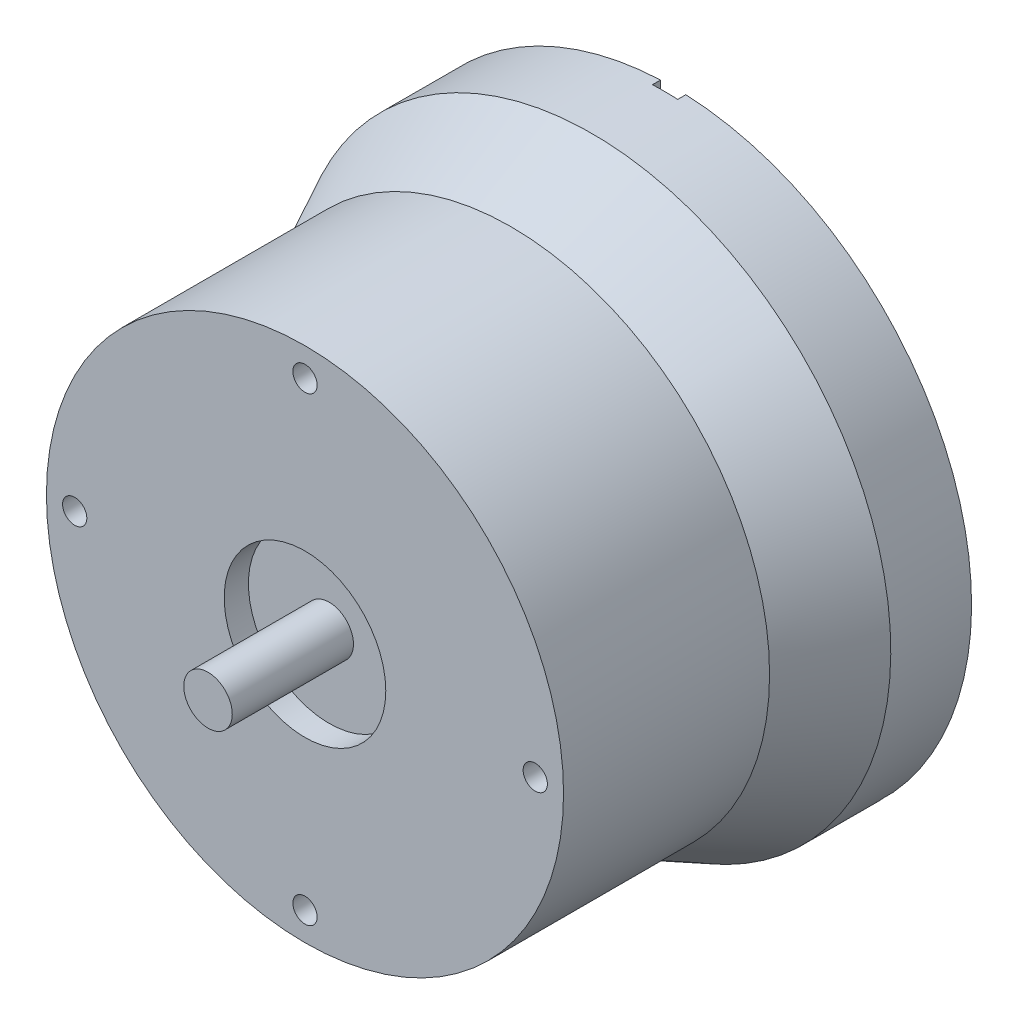
ISO-10303-21;
HEADER;
FILE_DESCRIPTION(('STEP AP214'),'2;1');
FILE_NAME('part.step','',(''),(''),'','','');
FILE_SCHEMA(('AUTOMOTIVE_DESIGN { 1 0 10303 214 1 1 1 1 }'));
ENDSEC;
DATA;
#1=APPLICATION_CONTEXT('core data for automotive mechanical design processes');
#2=APPLICATION_PROTOCOL_DEFINITION('international standard','automotive_design',2000,#1);
#3=PRODUCT_CONTEXT('',#1,'mechanical');
#4=PRODUCT('Part','Part','',(#3));
#5=PRODUCT_RELATED_PRODUCT_CATEGORY('part','',(#4));
#6=PRODUCT_DEFINITION_FORMATION('','',#4);
#7=PRODUCT_DEFINITION_CONTEXT('part definition',#1,'design');
#8=PRODUCT_DEFINITION('design','',#6,#7);
#9=PRODUCT_DEFINITION_SHAPE('','',#8);
#10=(LENGTH_UNIT() NAMED_UNIT(*) SI_UNIT(.MILLI.,.METRE.));
#11=(NAMED_UNIT(*) PLANE_ANGLE_UNIT() SI_UNIT($,.RADIAN.));
#12=(NAMED_UNIT(*) SI_UNIT($,.STERADIAN.) SOLID_ANGLE_UNIT());
#13=UNCERTAINTY_MEASURE_WITH_UNIT(LENGTH_MEASURE(1.E-05),#10,'distance_accuracy_value','');
#14=(GEOMETRIC_REPRESENTATION_CONTEXT(3) GLOBAL_UNCERTAINTY_ASSIGNED_CONTEXT((#13)) GLOBAL_UNIT_ASSIGNED_CONTEXT((#10,
#11,#12)) REPRESENTATION_CONTEXT('',''));
#15=CARTESIAN_POINT('',(0.,0.,0.));
#16=DIRECTION('',(0.,0.,1.));
#17=DIRECTION('',(1.,0.,0.));
#18=AXIS2_PLACEMENT_3D('',#15,#16,#17);
#19=CARTESIAN_POINT('',(0.,0.,-44.5));
#20=DIRECTION('',(0.,0.,-1.));
#21=DIRECTION('',(-1.,0.,0.));
#22=AXIS2_PLACEMENT_3D('',#19,#20,#21);
#23=PLANE('',#22);
#24=DIRECTION('',(0.707180163307406,-0.707033391449449,0.));
#25=VECTOR('',#24,1.);
#26=CARTESIAN_POINT('',(-1.06304494408269,-1.06326561977272,-44.5));
#27=LINE('',#26,#25);
#28=CARTESIAN_POINT('',(22.9810804731683,-25.1024008053038,-44.5));
#29=VERTEX_POINT('',#28);
#30=CARTESIAN_POINT('',(25.0810087902343,-27.2018932808764,-44.5));
#31=VERTEX_POINT('',#30);
#32=EDGE_CURVE('E243',#29,#31,#27,.T.);
#33=ORIENTED_EDGE('',*,*,#32,.F.);
#34=CARTESIAN_POINT('',(24.0416305603424,-24.0416305603428,-44.5));
#35=DIRECTION('',(0.,0.,-1.));
#36=DIRECTION('',(-1.,0.,0.));
#37=AXIS2_PLACEMENT_3D('',#34,#35,#36);
#38=CIRCLE('',#37,1.49999999999987);
#39=CARTESIAN_POINT('',(25.1022907321224,-22.9809703885628,-44.5));
#40=VERTEX_POINT('',#39);
#41=EDGE_CURVE('E240',#40,#29,#38,.T.);
#42=ORIENTED_EDGE('',*,*,#41,.F.);
#43=DIRECTION('',(0.737585211852994,-0.675254067189361,0.));
#44=VECTOR('',#43,1.);
#45=CARTESIAN_POINT('',(0.,0.,-44.5));
#46=LINE('',#45,#44);
#47=CARTESIAN_POINT('',(27.2906528385608,-24.9844004860064,-44.5));
#48=VERTEX_POINT('',#47);
#49=EDGE_CURVE('E236',#40,#48,#46,.T.);
#50=ORIENTED_EDGE('',*,*,#49,.T.);
#51=CARTESIAN_POINT('',(0.,0.,-44.5));
#52=DIRECTION('',(0.,0.,-1.));
#53=DIRECTION('',(-1.,0.,0.));
#54=AXIS2_PLACEMENT_3D('',#51,#52,#53);
#55=CIRCLE('',#54,37.);
#56=EDGE_CURVE('E239',#48,#31,#55,.T.);
#57=ORIENTED_EDGE('',*,*,#56,.T.);
#58=EDGE_LOOP('',(#33,#42,#50,#57));
#59=FACE_BOUND('',#58,.T.);
#60=ADVANCED_FACE('F45',(#59),#23,.T.);
#61=CARTESIAN_POINT('',(0.,0.,-45.5));
#62=DIRECTION('',(0.,0.,1.));
#63=DIRECTION('',(1.,0.,0.));
#64=AXIS2_PLACEMENT_3D('',#61,#62,#63);
#65=CYLINDRICAL_SURFACE('',#64,37.);
#66=CARTESIAN_POINT('',(0.,0.,-35.5));
#67=DIRECTION('',(0.,0.,-1.));
#68=DIRECTION('',(-1.,0.,0.));
#69=AXIS2_PLACEMENT_3D('',#66,#67,#68);
#70=CIRCLE('',#69,37.);
#71=CARTESIAN_POINT('',(-37.,0.,-35.5));
#72=VERTEX_POINT('',#71);
#73=EDGE_CURVE('E56',#72,#72,#70,.T.);
#74=ORIENTED_EDGE('',*,*,#73,.T.);
#75=EDGE_LOOP('',(#74));
#76=FACE_BOUND('',#75,.T.);
#77=DIRECTION('',(0.,0.,-1.));
#78=VECTOR('',#77,1.);
#79=CARTESIAN_POINT('',(1.63230490346124,36.9639767977167,-44.5));
#80=LINE('',#79,#78);
#81=CARTESIAN_POINT('',(1.63230490346124,36.9639767977167,-44.5));
#82=VERTEX_POINT('',#81);
#83=CARTESIAN_POINT('',(1.63230490346124,36.9639767977167,-45.5));
#84=VERTEX_POINT('',#83);
#85=EDGE_CURVE('E211',#82,#84,#80,.T.);
#86=ORIENTED_EDGE('',*,*,#85,.F.);
#87=CARTESIAN_POINT('',(0.,0.,-44.5));
#88=DIRECTION('',(0.,0.,-1.));
#89=DIRECTION('',(-1.,0.,0.));
#90=AXIS2_PLACEMENT_3D('',#87,#88,#89);
#91=CIRCLE('',#90,37.);
#92=CARTESIAN_POINT('',(-1.5,36.9695820912274,-44.5));
#93=VERTEX_POINT('',#92);
#94=EDGE_CURVE('E913',#93,#82,#91,.T.);
#95=ORIENTED_EDGE('',*,*,#94,.F.);
#96=DIRECTION('',(0.,0.,-1.));
#97=VECTOR('',#96,1.);
#98=CARTESIAN_POINT('',(-1.5,36.9695820912274,-44.5));
#99=LINE('',#98,#97);
#100=CARTESIAN_POINT('',(-1.5,36.9695820912274,-45.5));
#101=VERTEX_POINT('',#100);
#102=EDGE_CURVE('E189',#93,#101,#99,.T.);
#103=ORIENTED_EDGE('',*,*,#102,.T.);
#104=CARTESIAN_POINT('',(0.,0.,-45.5));
#105=DIRECTION('',(0.,0.,-1.));
#106=DIRECTION('',(-1.,0.,0.));
#107=AXIS2_PLACEMENT_3D('',#104,#105,#106);
#108=CIRCLE('',#107,37.);
#109=CARTESIAN_POINT('',(-27.2021023661195,-25.0807820225598,-45.5));
#110=VERTEX_POINT('',#109);
#111=EDGE_CURVE('E198',#110,#101,#108,.T.);
#112=ORIENTED_EDGE('',*,*,#111,.F.);
#113=DIRECTION('',(0.,0.,-1.));
#114=VECTOR('',#113,1.);
#115=CARTESIAN_POINT('',(-27.2021023661195,-25.0807820225598,-44.5));
#116=LINE('',#115,#114);
#117=CARTESIAN_POINT('',(-27.2021023661195,-25.0807820225598,-44.5));
#118=VERTEX_POINT('',#117);
#119=EDGE_CURVE('E204',#118,#110,#116,.T.);
#120=ORIENTED_EDGE('',*,*,#119,.F.);
#121=CARTESIAN_POINT('',(0.,0.,-44.5));
#122=DIRECTION('',(0.,0.,-1.));
#123=DIRECTION('',(-1.,0.,0.));
#124=AXIS2_PLACEMENT_3D('',#121,#122,#123);
#125=CIRCLE('',#124,37.);
#126=CARTESIAN_POINT('',(-25.0807820225598,-27.2021023661194,-44.5));
#127=VERTEX_POINT('',#126);
#128=EDGE_CURVE('E220',#127,#118,#125,.T.);
#129=ORIENTED_EDGE('',*,*,#128,.F.);
#130=DIRECTION('',(0.,0.,-1.));
#131=VECTOR('',#130,1.);
#132=CARTESIAN_POINT('',(-25.0807820225598,-27.2021023661194,-44.5));
#133=LINE('',#132,#131);
#134=CARTESIAN_POINT('',(-25.0807820225598,-27.2021023661194,-45.5));
#135=VERTEX_POINT('',#134);
#136=EDGE_CURVE('E231',#127,#135,#133,.T.);
#137=ORIENTED_EDGE('',*,*,#136,.T.);
#138=CARTESIAN_POINT('',(25.0810087902343,-27.2018932808764,-45.5));
#139=VERTEX_POINT('',#138);
#140=EDGE_CURVE('E282',#139,#135,#108,.T.);
#141=ORIENTED_EDGE('',*,*,#140,.F.);
#142=DIRECTION('',(0.,0.,-1.));
#143=VECTOR('',#142,1.);
#144=CARTESIAN_POINT('',(25.0810087902343,-27.2018932808764,-44.5));
#145=LINE('',#144,#143);
#146=EDGE_CURVE('E259',#31,#139,#145,.T.);
#147=ORIENTED_EDGE('',*,*,#146,.F.);
#148=ORIENTED_EDGE('',*,*,#56,.F.);
#149=DIRECTION('',(0.,0.,-1.));
#150=VECTOR('',#149,1.);
#151=CARTESIAN_POINT('',(27.2906528385608,-24.9844004860064,-44.5));
#152=LINE('',#151,#150);
#153=CARTESIAN_POINT('',(27.2906528385608,-24.9844004860064,-45.5));
#154=VERTEX_POINT('',#153);
#155=EDGE_CURVE('E283',#48,#154,#152,.T.);
#156=ORIENTED_EDGE('',*,*,#155,.T.);
#157=EDGE_CURVE('E352',#84,#154,#108,.T.);
#158=ORIENTED_EDGE('',*,*,#157,.F.);
#159=EDGE_LOOP('',(#86,#95,#103,#112,#120,#129,#137,#141,#147,#148,#156,#158));
#160=FACE_BOUND('',#159,.T.);
#161=ADVANCED_FACE('F280',(#76,#160),#65,.T.);
#162=CARTESIAN_POINT('',(0.,0.,-45.5));
#163=DIRECTION('',(0.,0.,-1.));
#164=DIRECTION('',(-1.,0.,0.));
#165=AXIS2_PLACEMENT_3D('',#162,#163,#164);
#166=PLANE('',#165);
#167=CARTESIAN_POINT('',(24.0416305603424,-24.0416305603428,-45.5));
#168=DIRECTION('',(0.,0.,-1.));
#169=DIRECTION('',(-1.,0.,0.));
#170=AXIS2_PLACEMENT_3D('',#167,#168,#169);
#171=CIRCLE('',#170,1.49999999999987);
#172=CARTESIAN_POINT('',(22.9809703885627,-25.1022907321225,-45.5));
#173=VERTEX_POINT('',#172);
#174=CARTESIAN_POINT('',(25.1022907321154,-22.9809703885564,-45.5));
#175=VERTEX_POINT('',#174);
#176=EDGE_CURVE('E923',#173,#175,#171,.T.);
#177=ORIENTED_EDGE('',*,*,#176,.F.);
#178=DIRECTION('',(0.707180163307406,-0.707033391449449,0.));
#179=VECTOR('',#178,1.);
#180=CARTESIAN_POINT('',(-1.06304494408269,-1.06326561977272,-45.5));
#181=LINE('',#180,#179);
#182=EDGE_CURVE('E270',#173,#139,#181,.T.);
#183=ORIENTED_EDGE('',*,*,#182,.T.);
#184=ORIENTED_EDGE('',*,*,#140,.T.);
#185=DIRECTION('',(-0.707106781186553,-0.707106781186542,0.));
#186=VECTOR('',#185,1.);
#187=CARTESIAN_POINT('',(1.06066017178001,-1.06066017178003,-45.5));
#188=LINE('',#187,#186);
#189=CARTESIAN_POINT('',(-22.9809703885628,-25.1022907321224,-45.5));
#190=VERTEX_POINT('',#189);
#191=EDGE_CURVE('E226',#190,#135,#188,.T.);
#192=ORIENTED_EDGE('',*,*,#191,.F.);
#193=CARTESIAN_POINT('',(-24.0416305603426,-24.0416305603426,-45.5));
#194=DIRECTION('',(0.,0.,-1.));
#195=DIRECTION('',(-1.,0.,0.));
#196=AXIS2_PLACEMENT_3D('',#193,#194,#195);
#197=CIRCLE('',#196,1.5);
#198=CARTESIAN_POINT('',(-25.1022907321224,-22.9809703885628,-45.5));
#199=VERTEX_POINT('',#198);
#200=EDGE_CURVE('E936',#199,#190,#197,.T.);
#201=ORIENTED_EDGE('',*,*,#200,.F.);
#202=DIRECTION('',(-0.707106781186549,-0.707106781186546,0.));
#203=VECTOR('',#202,1.);
#204=CARTESIAN_POINT('',(-1.06066017177978,1.06066017177978,-45.5));
#205=LINE('',#204,#203);
#206=EDGE_CURVE('E217',#199,#110,#205,.T.);
#207=ORIENTED_EDGE('',*,*,#206,.T.);
#208=ORIENTED_EDGE('',*,*,#111,.T.);
#209=DIRECTION('',(0.,1.,0.));
#210=VECTOR('',#209,1.);
#211=CARTESIAN_POINT('',(-1.5,0.,-45.5));
#212=LINE('',#211,#210);
#213=CARTESIAN_POINT('',(-1.5,34.,-45.5));
#214=VERTEX_POINT('',#213);
#215=EDGE_CURVE('E185',#214,#101,#212,.T.);
#216=ORIENTED_EDGE('',*,*,#215,.F.);
#217=CARTESIAN_POINT('',(0.,34.,-45.5));
#218=DIRECTION('',(0.,0.,-1.));
#219=DIRECTION('',(-1.,0.,0.));
#220=AXIS2_PLACEMENT_3D('',#217,#218,#219);
#221=CIRCLE('',#220,1.5);
#222=CARTESIAN_POINT('',(1.49900317626978,33.9453238851682,-45.5));
#223=VERTEX_POINT('',#222);
#224=EDGE_CURVE('E167',#223,#214,#221,.T.);
#225=ORIENTED_EDGE('',*,*,#224,.F.);
#226=DIRECTION('',(0.0441163487421956,0.999026399938288,0.));
#227=VECTOR('',#226,1.);
#228=CARTESIAN_POINT('',(0.,0.,-45.5));
#229=LINE('',#228,#227);
#230=EDGE_CURVE('E199',#223,#84,#229,.T.);
#231=ORIENTED_EDGE('',*,*,#230,.T.);
#232=ORIENTED_EDGE('',*,*,#157,.T.);
#233=DIRECTION('',(0.737585211852994,-0.675254067189361,0.));
#234=VECTOR('',#233,1.);
#235=CARTESIAN_POINT('',(0.,0.,-45.5));
#236=LINE('',#235,#234);
#237=EDGE_CURVE('E246',#175,#154,#236,.T.);
#238=ORIENTED_EDGE('',*,*,#237,.F.);
#239=EDGE_LOOP('',(#177,#183,#184,#192,#201,#207,#208,#216,#225,#231,#232,#238));
#240=FACE_BOUND('',#239,.T.);
#241=CARTESIAN_POINT('',(-28.,-5.,-45.5));
#242=DIRECTION('',(0.,0.,-1.));
#243=DIRECTION('',(-1.,0.,0.));
#244=AXIS2_PLACEMENT_3D('',#241,#242,#243);
#245=CIRCLE('',#244,3.);
#246=CARTESIAN_POINT('',(-31.,-5.,-45.5));
#247=VERTEX_POINT('',#246);
#248=EDGE_CURVE('E210',#247,#247,#245,.T.);
#249=ORIENTED_EDGE('',*,*,#248,.F.);
#250=EDGE_LOOP('',(#249));
#251=FACE_BOUND('',#250,.T.);
#252=CARTESIAN_POINT('',(-28.,5.,-45.5));
#253=DIRECTION('',(0.,0.,-1.));
#254=DIRECTION('',(-1.,0.,0.));
#255=AXIS2_PLACEMENT_3D('',#252,#253,#254);
#256=CIRCLE('',#255,3.);
#257=CARTESIAN_POINT('',(-31.,5.,-45.5));
#258=VERTEX_POINT('',#257);
#259=EDGE_CURVE('E292',#258,#258,#256,.T.);
#260=ORIENTED_EDGE('',*,*,#259,.F.);
#261=EDGE_LOOP('',(#260));
#262=FACE_BOUND('',#261,.T.);
#263=DIRECTION('',(1.,0.,0.));
#264=VECTOR('',#263,1.);
#265=CARTESIAN_POINT('',(0.,10.,-45.5));
#266=LINE('',#265,#264);
#267=CARTESIAN_POINT('',(-20.,10.,-45.5));
#268=VERTEX_POINT('',#267);
#269=CARTESIAN_POINT('',(31.4483703870328,10.,-45.5));
#270=VERTEX_POINT('',#269);
#271=EDGE_CURVE('E64',#268,#270,#266,.T.);
#272=ORIENTED_EDGE('',*,*,#271,.F.);
#273=DIRECTION('',(0.,-1.,0.));
#274=VECTOR('',#273,1.);
#275=CARTESIAN_POINT('',(-20.,0.,-45.5));
#276=LINE('',#275,#274);
#277=CARTESIAN_POINT('',(-20.,-10.,-45.5));
#278=VERTEX_POINT('',#277);
#279=EDGE_CURVE('E304',#268,#278,#276,.T.);
#280=ORIENTED_EDGE('',*,*,#279,.T.);
#281=DIRECTION('',(-1.,0.,0.));
#282=VECTOR('',#281,1.);
#283=CARTESIAN_POINT('',(0.,-10.,-45.5));
#284=LINE('',#283,#282);
#285=CARTESIAN_POINT('',(31.4483703870328,-10.,-45.5));
#286=VERTEX_POINT('',#285);
#287=EDGE_CURVE('E316',#286,#278,#284,.T.);
#288=ORIENTED_EDGE('',*,*,#287,.F.);
#289=CARTESIAN_POINT('',(0.,0.,-45.5));
#290=DIRECTION('',(0.,0.,-1.));
#291=DIRECTION('',(-1.,0.,0.));
#292=AXIS2_PLACEMENT_3D('',#289,#290,#291);
#293=CIRCLE('',#292,33.);
#294=EDGE_CURVE('E313',#270,#286,#293,.T.);
#295=ORIENTED_EDGE('',*,*,#294,.F.);
#296=EDGE_LOOP('',(#272,#280,#288,#295));
#297=FACE_BOUND('',#296,.T.);
#298=ADVANCED_FACE('F194',(#240,#251,#262,#297),#166,.T.);
#299=CARTESIAN_POINT('',(0.,0.,-25.5));
#300=DIRECTION('',(0.,0.,1.));
#301=DIRECTION('',(1.,0.,0.));
#302=AXIS2_PLACEMENT_3D('',#299,#300,#301);
#303=CYLINDRICAL_SURFACE('',#302,32.);
#304=CARTESIAN_POINT('',(0.,0.,-25.5));
#305=DIRECTION('',(0.,0.,1.));
#306=DIRECTION('',(1.,0.,0.));
#307=AXIS2_PLACEMENT_3D('',#304,#305,#306);
#308=CIRCLE('',#307,32.);
#309=CARTESIAN_POINT('',(32.,0.,-25.5));
#310=VERTEX_POINT('',#309);
#311=EDGE_CURVE('E361',#310,#310,#308,.T.);
#312=ORIENTED_EDGE('',*,*,#311,.T.);
#313=EDGE_LOOP('',(#312));
#314=FACE_BOUND('',#313,.T.);
#315=CARTESIAN_POINT('',(0.,0.,0.));
#316=DIRECTION('',(0.,0.,1.));
#317=DIRECTION('',(1.,0.,0.));
#318=AXIS2_PLACEMENT_3D('',#315,#316,#317);
#319=CIRCLE('',#318,32.);
#320=CARTESIAN_POINT('',(32.,0.,0.));
#321=VERTEX_POINT('',#320);
#322=EDGE_CURVE('E12',#321,#321,#319,.T.);
#323=ORIENTED_EDGE('',*,*,#322,.F.);
#324=EDGE_LOOP('',(#323));
#325=FACE_BOUND('',#324,.T.);
#326=ADVANCED_FACE('F47',(#314,#325),#303,.T.);
#327=CARTESIAN_POINT('',(0.,0.,0.));
#328=DIRECTION('',(0.,0.,1.));
#329=DIRECTION('',(1.,0.,0.));
#330=AXIS2_PLACEMENT_3D('',#327,#328,#329);
#331=PLANE('',#330);
#332=CARTESIAN_POINT('',(0.,0.,0.));
#333=DIRECTION('',(0.,0.,1.));
#334=DIRECTION('',(1.,0.,0.));
#335=AXIS2_PLACEMENT_3D('',#332,#333,#334);
#336=CIRCLE('',#335,10.);
#337=CARTESIAN_POINT('',(10.,0.,0.));
#338=VERTEX_POINT('',#337);
#339=EDGE_CURVE('E931',#338,#338,#336,.T.);
#340=ORIENTED_EDGE('',*,*,#339,.F.);
#341=EDGE_LOOP('',(#340));
#342=FACE_BOUND('',#341,.T.);
#343=CARTESIAN_POINT('',(28.5,0.,0.));
#344=DIRECTION('',(0.,0.,1.));
#345=DIRECTION('',(1.,0.,0.));
#346=AXIS2_PLACEMENT_3D('',#343,#344,#345);
#347=CIRCLE('',#346,1.5);
#348=CARTESIAN_POINT('',(30.,0.,0.));
#349=VERTEX_POINT('',#348);
#350=EDGE_CURVE('E331',#349,#349,#347,.T.);
#351=ORIENTED_EDGE('',*,*,#350,.F.);
#352=EDGE_LOOP('',(#351));
#353=FACE_BOUND('',#352,.T.);
#354=CARTESIAN_POINT('',(0.,28.5,0.));
#355=DIRECTION('',(0.,0.,1.));
#356=DIRECTION('',(1.,0.,0.));
#357=AXIS2_PLACEMENT_3D('',#354,#355,#356);
#358=CIRCLE('',#357,1.5);
#359=CARTESIAN_POINT('',(1.5,28.5,0.));
#360=VERTEX_POINT('',#359);
#361=EDGE_CURVE('E337',#360,#360,#358,.T.);
#362=ORIENTED_EDGE('',*,*,#361,.F.);
#363=EDGE_LOOP('',(#362));
#364=FACE_BOUND('',#363,.T.);
#365=CARTESIAN_POINT('',(-28.5,0.,0.));
#366=DIRECTION('',(0.,0.,1.));
#367=DIRECTION('',(1.,0.,0.));
#368=AXIS2_PLACEMENT_3D('',#365,#366,#367);
#369=CIRCLE('',#368,1.5);
#370=CARTESIAN_POINT('',(-27.,0.,0.));
#371=VERTEX_POINT('',#370);
#372=EDGE_CURVE('E343',#371,#371,#369,.T.);
#373=ORIENTED_EDGE('',*,*,#372,.F.);
#374=EDGE_LOOP('',(#373));
#375=FACE_BOUND('',#374,.T.);
#376=CARTESIAN_POINT('',(0.,-28.5,0.));
#377=DIRECTION('',(0.,0.,1.));
#378=DIRECTION('',(1.,0.,0.));
#379=AXIS2_PLACEMENT_3D('',#376,#377,#378);
#380=CIRCLE('',#379,1.5);
#381=CARTESIAN_POINT('',(1.5,-28.5,0.));
#382=VERTEX_POINT('',#381);
#383=EDGE_CURVE('E322',#382,#382,#380,.T.);
#384=ORIENTED_EDGE('',*,*,#383,.F.);
#385=EDGE_LOOP('',(#384));
#386=FACE_BOUND('',#385,.T.);
#387=ORIENTED_EDGE('',*,*,#322,.T.);
#388=EDGE_LOOP('',(#387));
#389=FACE_BOUND('',#388,.T.);
#390=ADVANCED_FACE('F372',(#342,#353,#364,#375,#386,#389),#331,.T.);
#391=CARTESIAN_POINT('',(0.,0.,-25.5));
#392=DIRECTION('',(0.,0.,-1.));
#393=DIRECTION('',(-1.,0.,0.));
#394=AXIS2_PLACEMENT_3D('',#391,#392,#393);
#395=CONICAL_SURFACE('',#394,32.,0.463647609000806);
#396=ORIENTED_EDGE('',*,*,#311,.F.);
#397=EDGE_LOOP('',(#396));
#398=FACE_BOUND('',#397,.T.);
#399=ORIENTED_EDGE('',*,*,#73,.F.);
#400=EDGE_LOOP('',(#399));
#401=FACE_BOUND('',#400,.T.);
#402=ADVANCED_FACE('F362',(#398,#401),#395,.T.);
#403=CARTESIAN_POINT('',(0.,-28.5,-10.));
#404=DIRECTION('',(0.,0.,1.));
#405=DIRECTION('',(1.,0.,0.));
#406=AXIS2_PLACEMENT_3D('',#403,#404,#405);
#407=CYLINDRICAL_SURFACE('',#406,1.5);
#408=CARTESIAN_POINT('',(0.,-28.5,-10.));
#409=DIRECTION('',(0.,0.,1.));
#410=DIRECTION('',(1.,0.,0.));
#411=AXIS2_PLACEMENT_3D('',#408,#409,#410);
#412=CIRCLE('',#411,1.5);
#413=CARTESIAN_POINT('',(1.5,-28.5,-10.));
#414=VERTEX_POINT('',#413);
#415=EDGE_CURVE('E346',#414,#414,#412,.T.);
#416=ORIENTED_EDGE('',*,*,#415,.F.);
#417=EDGE_LOOP('',(#416));
#418=FACE_BOUND('',#417,.T.);
#419=ORIENTED_EDGE('',*,*,#383,.T.);
#420=EDGE_LOOP('',(#419));
#421=FACE_BOUND('',#420,.T.);
#422=ADVANCED_FACE('F371',(#418,#421),#407,.F.);
#423=CARTESIAN_POINT('',(0.,0.,-10.));
#424=DIRECTION('',(0.,0.,1.));
#425=DIRECTION('',(1.,0.,0.));
#426=AXIS2_PLACEMENT_3D('',#423,#424,#425);
#427=PLANE('',#426);
#428=ORIENTED_EDGE('',*,*,#415,.T.);
#429=EDGE_LOOP('',(#428));
#430=FACE_BOUND('',#429,.T.);
#431=ADVANCED_FACE('F458',(#430),#427,.T.);
#432=CARTESIAN_POINT('',(-28.5,0.,-10.));
#433=DIRECTION('',(0.,0.,1.));
#434=DIRECTION('',(1.,0.,0.));
#435=AXIS2_PLACEMENT_3D('',#432,#433,#434);
#436=CYLINDRICAL_SURFACE('',#435,1.5);
#437=CARTESIAN_POINT('',(-28.5,0.,-10.));
#438=DIRECTION('',(0.,0.,1.));
#439=DIRECTION('',(1.,0.,0.));
#440=AXIS2_PLACEMENT_3D('',#437,#438,#439);
#441=CIRCLE('',#440,1.5);
#442=CARTESIAN_POINT('',(-27.,0.,-10.));
#443=VERTEX_POINT('',#442);
#444=EDGE_CURVE('E340',#443,#443,#441,.T.);
#445=ORIENTED_EDGE('',*,*,#444,.F.);
#446=EDGE_LOOP('',(#445));
#447=FACE_BOUND('',#446,.T.);
#448=ORIENTED_EDGE('',*,*,#372,.T.);
#449=EDGE_LOOP('',(#448));
#450=FACE_BOUND('',#449,.T.);
#451=ADVANCED_FACE('F454',(#447,#450),#436,.F.);
#452=CARTESIAN_POINT('',(0.,0.,-10.));
#453=DIRECTION('',(0.,0.,1.));
#454=DIRECTION('',(1.,0.,0.));
#455=AXIS2_PLACEMENT_3D('',#452,#453,#454);
#456=PLANE('',#455);
#457=ORIENTED_EDGE('',*,*,#444,.T.);
#458=EDGE_LOOP('',(#457));
#459=FACE_BOUND('',#458,.T.);
#460=ADVANCED_FACE('F450',(#459),#456,.T.);
#461=CARTESIAN_POINT('',(0.,28.5,-10.));
#462=DIRECTION('',(0.,0.,1.));
#463=DIRECTION('',(1.,0.,0.));
#464=AXIS2_PLACEMENT_3D('',#461,#462,#463);
#465=CYLINDRICAL_SURFACE('',#464,1.5);
#466=CARTESIAN_POINT('',(0.,28.5,-10.));
#467=DIRECTION('',(0.,0.,1.));
#468=DIRECTION('',(1.,0.,0.));
#469=AXIS2_PLACEMENT_3D('',#466,#467,#468);
#470=CIRCLE('',#469,1.5);
#471=CARTESIAN_POINT('',(1.5,28.5,-10.));
#472=VERTEX_POINT('',#471);
#473=EDGE_CURVE('E334',#472,#472,#470,.T.);
#474=ORIENTED_EDGE('',*,*,#473,.F.);
#475=EDGE_LOOP('',(#474));
#476=FACE_BOUND('',#475,.T.);
#477=ORIENTED_EDGE('',*,*,#361,.T.);
#478=EDGE_LOOP('',(#477));
#479=FACE_BOUND('',#478,.T.);
#480=ADVANCED_FACE('F446',(#476,#479),#465,.F.);
#481=CARTESIAN_POINT('',(0.,0.,-10.));
#482=DIRECTION('',(0.,0.,1.));
#483=DIRECTION('',(1.,0.,0.));
#484=AXIS2_PLACEMENT_3D('',#481,#482,#483);
#485=PLANE('',#484);
#486=ORIENTED_EDGE('',*,*,#473,.T.);
#487=EDGE_LOOP('',(#486));
#488=FACE_BOUND('',#487,.T.);
#489=ADVANCED_FACE('F442',(#488),#485,.T.);
#490=CARTESIAN_POINT('',(28.5,0.,-10.));
#491=DIRECTION('',(0.,0.,1.));
#492=DIRECTION('',(1.,0.,0.));
#493=AXIS2_PLACEMENT_3D('',#490,#491,#492);
#494=CYLINDRICAL_SURFACE('',#493,1.5);
#495=CARTESIAN_POINT('',(28.5,0.,-10.));
#496=DIRECTION('',(0.,0.,1.));
#497=DIRECTION('',(1.,0.,0.));
#498=AXIS2_PLACEMENT_3D('',#495,#496,#497);
#499=CIRCLE('',#498,1.5);
#500=CARTESIAN_POINT('',(30.,0.,-10.));
#501=VERTEX_POINT('',#500);
#502=EDGE_CURVE('E328',#501,#501,#499,.T.);
#503=ORIENTED_EDGE('',*,*,#502,.F.);
#504=EDGE_LOOP('',(#503));
#505=FACE_BOUND('',#504,.T.);
#506=ORIENTED_EDGE('',*,*,#350,.T.);
#507=EDGE_LOOP('',(#506));
#508=FACE_BOUND('',#507,.T.);
#509=ADVANCED_FACE('F438',(#505,#508),#494,.F.);
#510=CARTESIAN_POINT('',(0.,0.,-10.));
#511=DIRECTION('',(0.,0.,1.));
#512=DIRECTION('',(1.,0.,0.));
#513=AXIS2_PLACEMENT_3D('',#510,#511,#512);
#514=PLANE('',#513);
#515=ORIENTED_EDGE('',*,*,#502,.T.);
#516=EDGE_LOOP('',(#515));
#517=FACE_BOUND('',#516,.T.);
#518=ADVANCED_FACE('F435',(#517),#514,.T.);
#519=CARTESIAN_POINT('',(0.,10.,-40.5));
#520=DIRECTION('',(0.,1.,0.));
#521=DIRECTION('',(-1.,0.,0.));
#522=AXIS2_PLACEMENT_3D('',#519,#520,#521);
#523=PLANE('',#522);
#524=ORIENTED_EDGE('',*,*,#271,.T.);
#525=DIRECTION('',(0.,0.,-1.));
#526=VECTOR('',#525,1.);
#527=CARTESIAN_POINT('',(31.4483703870328,10.,-40.5));
#528=LINE('',#527,#526);
#529=CARTESIAN_POINT('',(31.4483703870328,10.,-40.5));
#530=VERTEX_POINT('',#529);
#531=EDGE_CURVE('E88',#530,#270,#528,.T.);
#532=ORIENTED_EDGE('',*,*,#531,.F.);
#533=DIRECTION('',(1.,0.,0.));
#534=VECTOR('',#533,1.);
#535=CARTESIAN_POINT('',(0.,10.,-40.5));
#536=LINE('',#535,#534);
#537=CARTESIAN_POINT('',(-20.,10.,-40.5));
#538=VERTEX_POINT('',#537);
#539=EDGE_CURVE('E300',#538,#530,#536,.T.);
#540=ORIENTED_EDGE('',*,*,#539,.F.);
#541=DIRECTION('',(0.,0.,-1.));
#542=VECTOR('',#541,1.);
#543=CARTESIAN_POINT('',(-20.,10.,-40.5));
#544=LINE('',#543,#542);
#545=EDGE_CURVE('E72',#538,#268,#544,.T.);
#546=ORIENTED_EDGE('',*,*,#545,.T.);
#547=EDGE_LOOP('',(#524,#532,#540,#546));
#548=FACE_BOUND('',#547,.T.);
#549=ADVANCED_FACE('F426',(#548),#523,.F.);
#550=CARTESIAN_POINT('',(-20.,0.,-40.5));
#551=DIRECTION('',(1.,0.,0.));
#552=DIRECTION('',(0.,1.,0.));
#553=AXIS2_PLACEMENT_3D('',#550,#551,#552);
#554=PLANE('',#553);
#555=ORIENTED_EDGE('',*,*,#279,.F.);
#556=ORIENTED_EDGE('',*,*,#545,.F.);
#557=DIRECTION('',(0.,-1.,0.));
#558=VECTOR('',#557,1.);
#559=CARTESIAN_POINT('',(-20.,0.,-40.5));
#560=LINE('',#559,#558);
#561=CARTESIAN_POINT('',(-20.,-10.,-40.5));
#562=VERTEX_POINT('',#561);
#563=EDGE_CURVE('E310',#538,#562,#560,.T.);
#564=ORIENTED_EDGE('',*,*,#563,.T.);
#565=DIRECTION('',(0.,0.,-1.));
#566=VECTOR('',#565,1.);
#567=CARTESIAN_POINT('',(-20.,-10.,-40.5));
#568=LINE('',#567,#566);
#569=EDGE_CURVE('E323',#562,#278,#568,.T.);
#570=ORIENTED_EDGE('',*,*,#569,.T.);
#571=EDGE_LOOP('',(#555,#556,#564,#570));
#572=FACE_BOUND('',#571,.T.);
#573=ADVANCED_FACE('F422',(#572),#554,.T.);
#574=CARTESIAN_POINT('',(0.,-10.,-40.5));
#575=DIRECTION('',(0.,-1.,0.));
#576=DIRECTION('',(0.,0.,-1.));
#577=AXIS2_PLACEMENT_3D('',#574,#575,#576);
#578=PLANE('',#577);
#579=ORIENTED_EDGE('',*,*,#287,.T.);
#580=ORIENTED_EDGE('',*,*,#569,.F.);
#581=DIRECTION('',(-1.,0.,0.));
#582=VECTOR('',#581,1.);
#583=CARTESIAN_POINT('',(0.,-10.,-40.5));
#584=LINE('',#583,#582);
#585=CARTESIAN_POINT('',(31.4483703870328,-10.,-40.5));
#586=VERTEX_POINT('',#585);
#587=EDGE_CURVE('E307',#586,#562,#584,.T.);
#588=ORIENTED_EDGE('',*,*,#587,.F.);
#589=DIRECTION('',(0.,0.,-1.));
#590=VECTOR('',#589,1.);
#591=CARTESIAN_POINT('',(31.4483703870328,-10.,-40.5));
#592=LINE('',#591,#590);
#593=EDGE_CURVE('E325',#586,#286,#592,.T.);
#594=ORIENTED_EDGE('',*,*,#593,.T.);
#595=EDGE_LOOP('',(#579,#580,#588,#594));
#596=FACE_BOUND('',#595,.T.);
#597=ADVANCED_FACE('F425',(#596),#578,.F.);
#598=CARTESIAN_POINT('',(0.,0.,-40.5));
#599=DIRECTION('',(0.,0.,-1.));
#600=DIRECTION('',(-1.,0.,0.));
#601=AXIS2_PLACEMENT_3D('',#598,#599,#600);
#602=CYLINDRICAL_SURFACE('',#601,33.);
#603=ORIENTED_EDGE('',*,*,#294,.T.);
#604=ORIENTED_EDGE('',*,*,#593,.F.);
#605=CARTESIAN_POINT('',(0.,0.,-40.5));
#606=DIRECTION('',(0.,0.,-1.));
#607=DIRECTION('',(-1.,0.,0.));
#608=AXIS2_PLACEMENT_3D('',#605,#606,#607);
#609=CIRCLE('',#608,33.);
#610=EDGE_CURVE('E303',#530,#586,#609,.T.);
#611=ORIENTED_EDGE('',*,*,#610,.F.);
#612=ORIENTED_EDGE('',*,*,#531,.T.);
#613=EDGE_LOOP('',(#603,#604,#611,#612));
#614=FACE_BOUND('',#613,.T.);
#615=ADVANCED_FACE('F420',(#614),#602,.F.);
#616=CARTESIAN_POINT('',(0.,0.,-40.5));
#617=DIRECTION('',(0.,0.,-1.));
#618=DIRECTION('',(-1.,0.,0.));
#619=AXIS2_PLACEMENT_3D('',#616,#617,#618);
#620=PLANE('',#619);
#621=ORIENTED_EDGE('',*,*,#539,.T.);
#622=ORIENTED_EDGE('',*,*,#610,.T.);
#623=ORIENTED_EDGE('',*,*,#587,.T.);
#624=ORIENTED_EDGE('',*,*,#563,.F.);
#625=EDGE_LOOP('',(#621,#622,#623,#624));
#626=FACE_BOUND('',#625,.T.);
#627=ADVANCED_FACE('F416',(#626),#620,.T.);
#628=CARTESIAN_POINT('',(-28.,5.,-55.5));
#629=DIRECTION('',(0.,0.,1.));
#630=DIRECTION('',(1.,0.,0.));
#631=AXIS2_PLACEMENT_3D('',#628,#629,#630);
#632=CYLINDRICAL_SURFACE('',#631,3.);
#633=CARTESIAN_POINT('',(-28.,5.,-55.5));
#634=DIRECTION('',(0.,0.,-1.));
#635=DIRECTION('',(-1.,0.,0.));
#636=AXIS2_PLACEMENT_3D('',#633,#634,#635);
#637=CIRCLE('',#636,3.);
#638=CARTESIAN_POINT('',(-31.,5.,-55.5));
#639=VERTEX_POINT('',#638);
#640=EDGE_CURVE('E295',#639,#639,#637,.T.);
#641=ORIENTED_EDGE('',*,*,#640,.F.);
#642=EDGE_LOOP('',(#641));
#643=FACE_BOUND('',#642,.T.);
#644=ORIENTED_EDGE('',*,*,#259,.T.);
#645=EDGE_LOOP('',(#644));
#646=FACE_BOUND('',#645,.T.);
#647=ADVANCED_FACE('F412',(#643,#646),#632,.T.);
#648=CARTESIAN_POINT('',(0.,0.,-55.5));
#649=DIRECTION('',(0.,0.,-1.));
#650=DIRECTION('',(-1.,0.,0.));
#651=AXIS2_PLACEMENT_3D('',#648,#649,#650);
#652=PLANE('',#651);
#653=ORIENTED_EDGE('',*,*,#640,.T.);
#654=EDGE_LOOP('',(#653));
#655=FACE_BOUND('',#654,.T.);
#656=ADVANCED_FACE('F408',(#655),#652,.T.);
#657=CARTESIAN_POINT('',(-28.,-5.,-55.5));
#658=DIRECTION('',(0.,0.,1.));
#659=DIRECTION('',(1.,0.,0.));
#660=AXIS2_PLACEMENT_3D('',#657,#658,#659);
#661=CYLINDRICAL_SURFACE('',#660,3.);
#662=CARTESIAN_POINT('',(-28.,-5.,-55.5));
#663=DIRECTION('',(0.,0.,-1.));
#664=DIRECTION('',(-1.,0.,0.));
#665=AXIS2_PLACEMENT_3D('',#662,#663,#664);
#666=CIRCLE('',#665,3.);
#667=CARTESIAN_POINT('',(-31.,-5.,-55.5));
#668=VERTEX_POINT('',#667);
#669=EDGE_CURVE('E289',#668,#668,#666,.T.);
#670=ORIENTED_EDGE('',*,*,#669,.F.);
#671=EDGE_LOOP('',(#670));
#672=FACE_BOUND('',#671,.T.);
#673=ORIENTED_EDGE('',*,*,#248,.T.);
#674=EDGE_LOOP('',(#673));
#675=FACE_BOUND('',#674,.T.);
#676=ADVANCED_FACE('F404',(#672,#675),#661,.T.);
#677=CARTESIAN_POINT('',(0.,0.,-55.5));
#678=DIRECTION('',(0.,0.,-1.));
#679=DIRECTION('',(-1.,0.,0.));
#680=AXIS2_PLACEMENT_3D('',#677,#678,#679);
#681=PLANE('',#680);
#682=ORIENTED_EDGE('',*,*,#669,.T.);
#683=EDGE_LOOP('',(#682));
#684=FACE_BOUND('',#683,.T.);
#685=ADVANCED_FACE('F397',(#684),#681,.T.);
#686=CARTESIAN_POINT('',(-1.06304494408269,-1.06326561977272,-44.5));
#687=DIRECTION('',(0.707033391449449,0.707180163307406,0.));
#688=DIRECTION('',(-0.707180163307406,0.707033391449449,0.));
#689=AXIS2_PLACEMENT_3D('',#686,#687,#688);
#690=PLANE('',#689);
#691=ORIENTED_EDGE('',*,*,#146,.T.);
#692=ORIENTED_EDGE('',*,*,#182,.F.);
#693=DIRECTION('',(0.,0.,-1.));
#694=VECTOR('',#693,1.);
#695=CARTESIAN_POINT('',(22.9809703885624,-25.1022907321228,-44.5));
#696=LINE('',#695,#694);
#697=CARTESIAN_POINT('',(22.9809703885627,-25.1022907321225,-44.5));
#698=VERTEX_POINT('',#697);
#699=EDGE_CURVE('E228',#698,#173,#696,.T.);
#700=ORIENTED_EDGE('',*,*,#699,.F.);
#701=CARTESIAN_POINT('',(22.9809703885624,-25.1022907321229,-44.5));
#702=DIRECTION('',(0.707180163310785,-0.70703339144607,0.));
#703=VECTOR('',#702,1.);
#704=LINE('',#701,#703);
#705=EDGE_CURVE('E255',#698,#29,#704,.T.);
#706=ORIENTED_EDGE('',*,*,#705,.T.);
#707=ORIENTED_EDGE('',*,*,#32,.T.);
#708=EDGE_LOOP('',(#691,#692,#700,#706,#707));
#709=FACE_BOUND('',#708,.T.);
#710=ADVANCED_FACE('F266',(#709),#690,.T.);
#711=CARTESIAN_POINT('',(0.,0.,-44.5));
#712=DIRECTION('',(0.675254067189361,0.737585211852994,0.));
#713=DIRECTION('',(-0.737585211852994,0.675254067189361,0.));
#714=AXIS2_PLACEMENT_3D('',#711,#712,#713);
#715=PLANE('',#714);
#716=ORIENTED_EDGE('',*,*,#237,.T.);
#717=ORIENTED_EDGE('',*,*,#155,.F.);
#718=ORIENTED_EDGE('',*,*,#49,.F.);
#719=DIRECTION('',(0.,0.,-1.));
#720=VECTOR('',#719,1.);
#721=CARTESIAN_POINT('',(25.1022907321224,-22.9809703885628,-44.5));
#722=LINE('',#721,#720);
#723=EDGE_CURVE('E251',#40,#175,#722,.T.);
#724=ORIENTED_EDGE('',*,*,#723,.T.);
#725=EDGE_LOOP('',(#716,#717,#718,#724));
#726=FACE_BOUND('',#725,.T.);
#727=ADVANCED_FACE('F396',(#726),#715,.F.);
#728=CARTESIAN_POINT('',(-1.06066017177978,1.06066017177978,-44.5));
#729=DIRECTION('',(0.707106781186546,-0.707106781186549,0.));
#730=DIRECTION('',(0.707106781186549,0.707106781186546,0.));
#731=AXIS2_PLACEMENT_3D('',#728,#729,#730);
#732=PLANE('',#731);
#733=ORIENTED_EDGE('',*,*,#206,.F.);
#734=DIRECTION('',(0.,0.,-1.));
#735=VECTOR('',#734,1.);
#736=CARTESIAN_POINT('',(-25.1022907321224,-22.9809703885628,-44.5));
#737=LINE('',#736,#735);
#738=CARTESIAN_POINT('',(-25.1022907321224,-22.9809703885628,-44.5));
#739=VERTEX_POINT('',#738);
#740=EDGE_CURVE('E200',#739,#199,#737,.T.);
#741=ORIENTED_EDGE('',*,*,#740,.F.);
#742=DIRECTION('',(-0.707106781186549,-0.707106781186546,0.));
#743=VECTOR('',#742,1.);
#744=CARTESIAN_POINT('',(-1.06066017177978,1.06066017177978,-44.5));
#745=LINE('',#744,#743);
#746=EDGE_CURVE('E223',#739,#118,#745,.T.);
#747=ORIENTED_EDGE('',*,*,#746,.T.);
#748=ORIENTED_EDGE('',*,*,#119,.T.);
#749=EDGE_LOOP('',(#733,#741,#747,#748));
#750=FACE_BOUND('',#749,.T.);
#751=ADVANCED_FACE('F400',(#750),#732,.T.);
#752=CARTESIAN_POINT('',(1.06066017178001,-1.06066017178003,-44.5));
#753=DIRECTION('',(0.707106781186542,-0.707106781186553,0.));
#754=DIRECTION('',(0.707106781186553,0.707106781186542,0.));
#755=AXIS2_PLACEMENT_3D('',#752,#753,#754);
#756=PLANE('',#755);
#757=ORIENTED_EDGE('',*,*,#191,.T.);
#758=ORIENTED_EDGE('',*,*,#136,.F.);
#759=DIRECTION('',(-0.707106781186553,-0.707106781186542,0.));
#760=VECTOR('',#759,1.);
#761=CARTESIAN_POINT('',(1.06066017178001,-1.06066017178003,-44.5));
#762=LINE('',#761,#760);
#763=CARTESIAN_POINT('',(-22.9809703885628,-25.1022907321224,-44.5));
#764=VERTEX_POINT('',#763);
#765=EDGE_CURVE('E216',#764,#127,#762,.T.);
#766=ORIENTED_EDGE('',*,*,#765,.F.);
#767=DIRECTION('',(0.,0.,-1.));
#768=VECTOR('',#767,1.);
#769=CARTESIAN_POINT('',(-22.9809703885628,-25.1022907321224,-44.5));
#770=LINE('',#769,#768);
#771=EDGE_CURVE('E225',#764,#190,#770,.T.);
#772=ORIENTED_EDGE('',*,*,#771,.T.);
#773=EDGE_LOOP('',(#757,#758,#766,#772));
#774=FACE_BOUND('',#773,.T.);
#775=ADVANCED_FACE('F391',(#774),#756,.F.);
#776=CARTESIAN_POINT('',(0.,0.,-44.5));
#777=DIRECTION('',(0.,0.,-1.));
#778=DIRECTION('',(-1.,0.,0.));
#779=AXIS2_PLACEMENT_3D('',#776,#777,#778);
#780=PLANE('',#779);
#781=CARTESIAN_POINT('',(-24.0416305603426,-24.0416305603426,-44.5));
#782=DIRECTION('',(0.,0.,-1.));
#783=DIRECTION('',(-1.,0.,0.));
#784=AXIS2_PLACEMENT_3D('',#781,#782,#783);
#785=CIRCLE('',#784,1.5);
#786=EDGE_CURVE('E214',#764,#739,#785,.T.);
#787=ORIENTED_EDGE('',*,*,#786,.F.);
#788=ORIENTED_EDGE('',*,*,#765,.T.);
#789=ORIENTED_EDGE('',*,*,#128,.T.);
#790=ORIENTED_EDGE('',*,*,#746,.F.);
#791=EDGE_LOOP('',(#787,#788,#789,#790));
#792=FACE_BOUND('',#791,.T.);
#793=ADVANCED_FACE('F791',(#792),#780,.T.);
#794=CARTESIAN_POINT('',(0.,0.,-44.5));
#795=DIRECTION('',(-0.999026399938288,0.0441163487421956,0.));
#796=DIRECTION('',(-0.0441163487421956,-0.999026399938288,0.));
#797=AXIS2_PLACEMENT_3D('',#794,#795,#796);
#798=PLANE('',#797);
#799=ORIENTED_EDGE('',*,*,#230,.F.);
#800=DIRECTION('',(0.,0.,-1.));
#801=VECTOR('',#800,1.);
#802=CARTESIAN_POINT('',(1.49900317626978,33.9453238851682,-44.5));
#803=LINE('',#802,#801);
#804=CARTESIAN_POINT('',(1.49900317626978,33.9453238851682,-44.5));
#805=VERTEX_POINT('',#804);
#806=EDGE_CURVE('E174',#805,#223,#803,.T.);
#807=ORIENTED_EDGE('',*,*,#806,.F.);
#808=DIRECTION('',(0.0441163487421956,0.999026399938288,0.));
#809=VECTOR('',#808,1.);
#810=CARTESIAN_POINT('',(0.,0.,-44.5));
#811=LINE('',#810,#809);
#812=EDGE_CURVE('E190',#805,#82,#811,.T.);
#813=ORIENTED_EDGE('',*,*,#812,.T.);
#814=ORIENTED_EDGE('',*,*,#85,.T.);
#815=EDGE_LOOP('',(#799,#807,#813,#814));
#816=FACE_BOUND('',#815,.T.);
#817=ADVANCED_FACE('F782',(#816),#798,.T.);
#818=CARTESIAN_POINT('',(-1.5,0.,-44.5));
#819=DIRECTION('',(-1.,0.,0.));
#820=DIRECTION('',(0.,0.,1.));
#821=AXIS2_PLACEMENT_3D('',#818,#819,#820);
#822=PLANE('',#821);
#823=ORIENTED_EDGE('',*,*,#215,.T.);
#824=ORIENTED_EDGE('',*,*,#102,.F.);
#825=DIRECTION('',(0.,1.,0.));
#826=VECTOR('',#825,1.);
#827=CARTESIAN_POINT('',(-1.5,0.,-44.5));
#828=LINE('',#827,#826);
#829=CARTESIAN_POINT('',(-1.5,34.,-44.5));
#830=VERTEX_POINT('',#829);
#831=EDGE_CURVE('E188',#830,#93,#828,.T.);
#832=ORIENTED_EDGE('',*,*,#831,.F.);
#833=DIRECTION('',(0.,0.,-1.));
#834=VECTOR('',#833,1.);
#835=CARTESIAN_POINT('',(-1.5,34.,-44.5));
#836=LINE('',#835,#834);
#837=EDGE_CURVE('E171',#830,#214,#836,.T.);
#838=ORIENTED_EDGE('',*,*,#837,.T.);
#839=EDGE_LOOP('',(#823,#824,#832,#838));
#840=FACE_BOUND('',#839,.T.);
#841=ADVANCED_FACE('F184',(#840),#822,.F.);
#842=CARTESIAN_POINT('',(0.,0.,-44.5));
#843=DIRECTION('',(0.,0.,-1.));
#844=DIRECTION('',(-1.,0.,0.));
#845=AXIS2_PLACEMENT_3D('',#842,#843,#844);
#846=PLANE('',#845);
#847=CARTESIAN_POINT('',(0.,34.,-44.5));
#848=DIRECTION('',(0.,0.,-1.));
#849=DIRECTION('',(-1.,0.,0.));
#850=AXIS2_PLACEMENT_3D('',#847,#848,#849);
#851=CIRCLE('',#850,1.5);
#852=EDGE_CURVE('E202',#830,#805,#851,.T.);
#853=ORIENTED_EDGE('',*,*,#852,.F.);
#854=ORIENTED_EDGE('',*,*,#831,.T.);
#855=ORIENTED_EDGE('',*,*,#94,.T.);
#856=ORIENTED_EDGE('',*,*,#812,.F.);
#857=EDGE_LOOP('',(#853,#854,#855,#856));
#858=FACE_BOUND('',#857,.T.);
#859=ADVANCED_FACE('F627',(#858),#846,.T.);
#860=CARTESIAN_POINT('',(0.,34.,-42.5));
#861=DIRECTION('',(0.,0.,-1.));
#862=DIRECTION('',(-1.,0.,0.));
#863=AXIS2_PLACEMENT_3D('',#860,#861,#862);
#864=CYLINDRICAL_SURFACE('',#863,1.5);
#865=ORIENTED_EDGE('',*,*,#806,.T.);
#866=ORIENTED_EDGE('',*,*,#224,.T.);
#867=ORIENTED_EDGE('',*,*,#837,.F.);
#868=ORIENTED_EDGE('',*,*,#852,.T.);
#869=EDGE_LOOP('',(#865,#866,#867,#868));
#870=FACE_BOUND('',#869,.T.);
#871=CARTESIAN_POINT('',(0.,34.,-42.5));
#872=DIRECTION('',(0.,0.,-1.));
#873=DIRECTION('',(-1.,0.,0.));
#874=AXIS2_PLACEMENT_3D('',#871,#872,#873);
#875=CIRCLE('',#874,1.5);
#876=CARTESIAN_POINT('',(-1.5,34.,-42.5));
#877=VERTEX_POINT('',#876);
#878=EDGE_CURVE('E179',#877,#877,#875,.T.);
#879=ORIENTED_EDGE('',*,*,#878,.F.);
#880=EDGE_LOOP('',(#879));
#881=FACE_BOUND('',#880,.T.);
#882=ADVANCED_FACE('F169',(#870,#881),#864,.F.);
#883=CARTESIAN_POINT('',(0.,0.,-42.5));
#884=DIRECTION('',(0.,0.,-1.));
#885=DIRECTION('',(-1.,0.,0.));
#886=AXIS2_PLACEMENT_3D('',#883,#884,#885);
#887=PLANE('',#886);
#888=ORIENTED_EDGE('',*,*,#878,.T.);
#889=EDGE_LOOP('',(#888));
#890=FACE_BOUND('',#889,.T.);
#891=ADVANCED_FACE('F634',(#890),#887,.T.);
#892=CARTESIAN_POINT('',(-24.0416305603426,-24.0416305603426,-42.5));
#893=DIRECTION('',(0.,0.,-1.));
#894=DIRECTION('',(-1.,0.,0.));
#895=AXIS2_PLACEMENT_3D('',#892,#893,#894);
#896=CYLINDRICAL_SURFACE('',#895,1.5);
#897=ORIENTED_EDGE('',*,*,#740,.T.);
#898=ORIENTED_EDGE('',*,*,#200,.T.);
#899=ORIENTED_EDGE('',*,*,#771,.F.);
#900=ORIENTED_EDGE('',*,*,#786,.T.);
#901=EDGE_LOOP('',(#897,#898,#899,#900));
#902=FACE_BOUND('',#901,.T.);
#903=CARTESIAN_POINT('',(-24.0416305603426,-24.0416305603426,-42.5));
#904=DIRECTION('',(0.,0.,-1.));
#905=DIRECTION('',(-1.,0.,0.));
#906=AXIS2_PLACEMENT_3D('',#903,#904,#905);
#907=CIRCLE('',#906,1.5);
#908=CARTESIAN_POINT('',(-25.5416305603426,-24.0416305603426,-42.5));
#909=VERTEX_POINT('',#908);
#910=EDGE_CURVE('E928',#909,#909,#907,.T.);
#911=ORIENTED_EDGE('',*,*,#910,.F.);
#912=EDGE_LOOP('',(#911));
#913=FACE_BOUND('',#912,.T.);
#914=ADVANCED_FACE('F643',(#902,#913),#896,.F.);
#915=CARTESIAN_POINT('',(0.,0.,-42.5));
#916=DIRECTION('',(0.,0.,-1.));
#917=DIRECTION('',(-1.,0.,0.));
#918=AXIS2_PLACEMENT_3D('',#915,#916,#917);
#919=PLANE('',#918);
#920=ORIENTED_EDGE('',*,*,#910,.T.);
#921=EDGE_LOOP('',(#920));
#922=FACE_BOUND('',#921,.T.);
#923=ADVANCED_FACE('F653',(#922),#919,.T.);
#924=CARTESIAN_POINT('',(24.0416305603424,-24.0416305603428,-42.5));
#925=DIRECTION('',(0.,0.,-1.));
#926=DIRECTION('',(-1.,0.,0.));
#927=AXIS2_PLACEMENT_3D('',#924,#925,#926);
#928=CYLINDRICAL_SURFACE('',#927,1.49999999999987);
#929=CARTESIAN_POINT('',(24.0416305603424,-24.0416305603428,-42.5));
#930=DIRECTION('',(0.,0.,-1.));
#931=DIRECTION('',(-1.,0.,0.));
#932=AXIS2_PLACEMENT_3D('',#929,#930,#931);
#933=CIRCLE('',#932,1.49999999999987);
#934=CARTESIAN_POINT('',(22.5416305603425,-24.0416305603428,-42.5));
#935=VERTEX_POINT('',#934);
#936=EDGE_CURVE('E924',#935,#935,#933,.T.);
#937=ORIENTED_EDGE('',*,*,#936,.F.);
#938=EDGE_LOOP('',(#937));
#939=FACE_BOUND('',#938,.T.);
#940=ORIENTED_EDGE('',*,*,#699,.T.);
#941=ORIENTED_EDGE('',*,*,#176,.T.);
#942=ORIENTED_EDGE('',*,*,#723,.F.);
#943=ORIENTED_EDGE('',*,*,#41,.T.);
#944=ORIENTED_EDGE('',*,*,#705,.F.);
#945=EDGE_LOOP('',(#940,#941,#942,#943,#944));
#946=FACE_BOUND('',#945,.T.);
#947=ADVANCED_FACE('F664',(#939,#946),#928,.F.);
#948=CARTESIAN_POINT('',(0.,0.,-42.5));
#949=DIRECTION('',(0.,0.,-1.));
#950=DIRECTION('',(-1.,0.,0.));
#951=AXIS2_PLACEMENT_3D('',#948,#949,#950);
#952=PLANE('',#951);
#953=ORIENTED_EDGE('',*,*,#936,.T.);
#954=EDGE_LOOP('',(#953));
#955=FACE_BOUND('',#954,.T.);
#956=ADVANCED_FACE('F674',(#955),#952,.T.);
#957=CARTESIAN_POINT('',(0.,0.,-3.));
#958=DIRECTION('',(0.,0.,1.));
#959=DIRECTION('',(1.,0.,0.));
#960=AXIS2_PLACEMENT_3D('',#957,#958,#959);
#961=CYLINDRICAL_SURFACE('',#960,10.);
#962=CARTESIAN_POINT('',(0.,0.,-3.));
#963=DIRECTION('',(0.,0.,1.));
#964=DIRECTION('',(1.,0.,0.));
#965=AXIS2_PLACEMENT_3D('',#962,#963,#964);
#966=CIRCLE('',#965,10.);
#967=CARTESIAN_POINT('',(10.,0.,-3.));
#968=VERTEX_POINT('',#967);
#969=EDGE_CURVE('E180',#968,#968,#966,.T.);
#970=ORIENTED_EDGE('',*,*,#969,.F.);
#971=EDGE_LOOP('',(#970));
#972=FACE_BOUND('',#971,.T.);
#973=ORIENTED_EDGE('',*,*,#339,.T.);
#974=EDGE_LOOP('',(#973));
#975=FACE_BOUND('',#974,.T.);
#976=ADVANCED_FACE('F685',(#972,#975),#961,.F.);
#977=CARTESIAN_POINT('',(0.,0.,-3.));
#978=DIRECTION('',(0.,0.,1.));
#979=DIRECTION('',(1.,0.,0.));
#980=AXIS2_PLACEMENT_3D('',#977,#978,#979);
#981=PLANE('',#980);
#982=CARTESIAN_POINT('',(0.,0.,-3.));
#983=DIRECTION('',(0.,0.,1.));
#984=DIRECTION('',(1.,0.,0.));
#985=AXIS2_PLACEMENT_3D('',#982,#983,#984);
#986=CIRCLE('',#985,3.);
#987=CARTESIAN_POINT('',(3.,0.,-3.));
#988=VERTEX_POINT('',#987);
#989=EDGE_CURVE('E949',#988,#988,#986,.T.);
#990=ORIENTED_EDGE('',*,*,#989,.F.);
#991=EDGE_LOOP('',(#990));
#992=FACE_BOUND('',#991,.T.);
#993=ORIENTED_EDGE('',*,*,#969,.T.);
#994=EDGE_LOOP('',(#993));
#995=FACE_BOUND('',#994,.T.);
#996=ADVANCED_FACE('F695',(#992,#995),#981,.T.);
#997=CARTESIAN_POINT('',(0.,0.,-3.));
#998=DIRECTION('',(0.,0.,1.));
#999=DIRECTION('',(1.,0.,0.));
#1000=AXIS2_PLACEMENT_3D('',#997,#998,#999);
#1001=CYLINDRICAL_SURFACE('',#1000,3.);
#1002=ORIENTED_EDGE('',*,*,#989,.T.);
#1003=EDGE_LOOP('',(#1002));
#1004=FACE_BOUND('',#1003,.T.);
#1005=CARTESIAN_POINT('',(0.,0.,12.));
#1006=DIRECTION('',(0.,0.,1.));
#1007=DIRECTION('',(1.,0.,0.));
#1008=AXIS2_PLACEMENT_3D('',#1005,#1006,#1007);
#1009=CIRCLE('',#1008,3.);
#1010=CARTESIAN_POINT('',(3.,0.,12.));
#1011=VERTEX_POINT('',#1010);
#1012=EDGE_CURVE('E954',#1011,#1011,#1009,.T.);
#1013=ORIENTED_EDGE('',*,*,#1012,.F.);
#1014=EDGE_LOOP('',(#1013));
#1015=FACE_BOUND('',#1014,.T.);
#1016=ADVANCED_FACE('F706',(#1004,#1015),#1001,.T.);
#1017=CARTESIAN_POINT('',(0.,0.,12.));
#1018=DIRECTION('',(0.,0.,1.));
#1019=DIRECTION('',(1.,0.,0.));
#1020=AXIS2_PLACEMENT_3D('',#1017,#1018,#1019);
#1021=PLANE('',#1020);
#1022=ORIENTED_EDGE('',*,*,#1012,.T.);
#1023=EDGE_LOOP('',(#1022));
#1024=FACE_BOUND('',#1023,.T.);
#1025=ADVANCED_FACE('F716',(#1024),#1021,.T.);
#1026=CLOSED_SHELL('',(#60,#161,#298,#326,#390,#402,#422,#431,#451,#460,#480,#489,#509,#518,
#549,#573,#597,#615,#627,#647,#656,#676,#685,#710,#727,#751,#775,#793,#817,#841,#859,#882,#891,
#914,#923,#947,#956,#976,#996,#1016,#1025));
#1027=MANIFOLD_SOLID_BREP('B2',#1026);
#1028=ADVANCED_BREP_SHAPE_REPRESENTATION('',(#18,#1027),#14);
#1029=SHAPE_DEFINITION_REPRESENTATION(#9,#1028);
ENDSEC;
END-ISO-10303-21;
